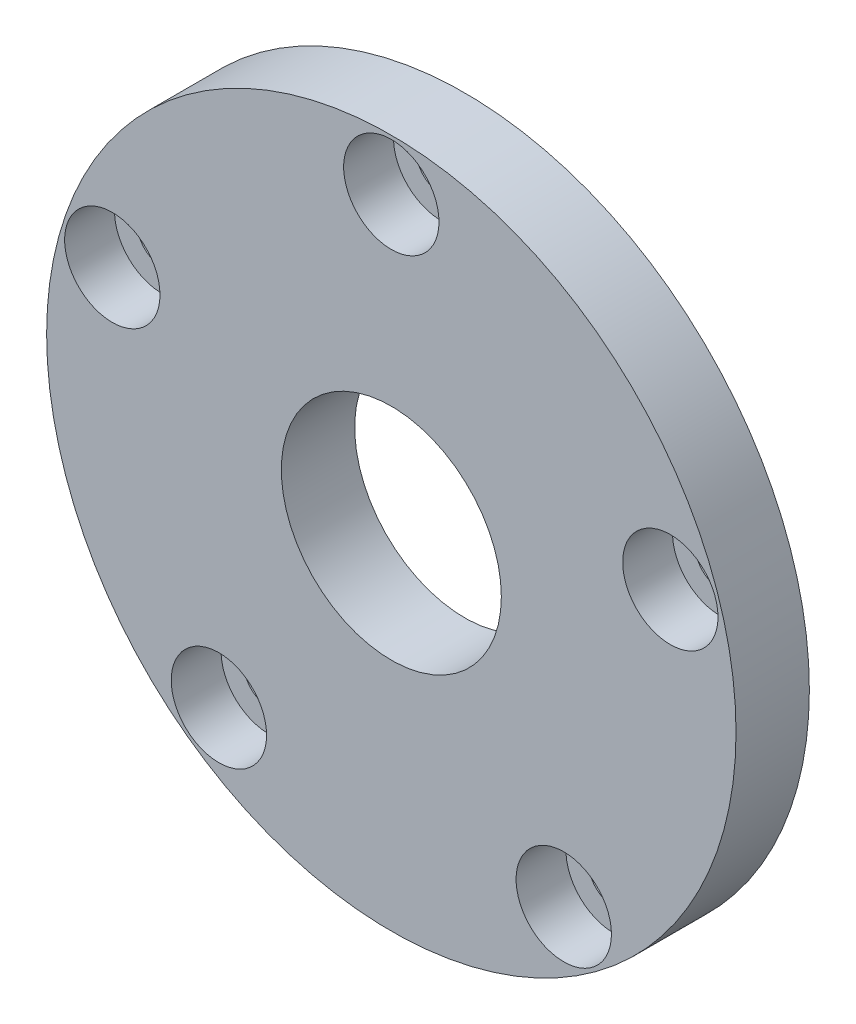
ISO-10303-21;
HEADER;
FILE_DESCRIPTION(('STEP AP214'),'2;1');
FILE_NAME('part.step','',(''),(''),'','','');
FILE_SCHEMA(('AUTOMOTIVE_DESIGN { 1 0 10303 214 1 1 1 1 }'));
ENDSEC;
DATA;
#1=APPLICATION_CONTEXT('core data for automotive mechanical design processes');
#2=APPLICATION_PROTOCOL_DEFINITION('international standard','automotive_design',2000,#1);
#3=PRODUCT_CONTEXT('',#1,'mechanical');
#4=PRODUCT('Part','Part','',(#3));
#5=PRODUCT_RELATED_PRODUCT_CATEGORY('part','',(#4));
#6=PRODUCT_DEFINITION_FORMATION('','',#4);
#7=PRODUCT_DEFINITION_CONTEXT('part definition',#1,'design');
#8=PRODUCT_DEFINITION('design','',#6,#7);
#9=PRODUCT_DEFINITION_SHAPE('','',#8);
#10=(LENGTH_UNIT() NAMED_UNIT(*) SI_UNIT(.MILLI.,.METRE.));
#11=(NAMED_UNIT(*) PLANE_ANGLE_UNIT() SI_UNIT($,.RADIAN.));
#12=(NAMED_UNIT(*) SI_UNIT($,.STERADIAN.) SOLID_ANGLE_UNIT());
#13=UNCERTAINTY_MEASURE_WITH_UNIT(LENGTH_MEASURE(1.E-05),#10,'distance_accuracy_value','');
#14=(GEOMETRIC_REPRESENTATION_CONTEXT(3) GLOBAL_UNCERTAINTY_ASSIGNED_CONTEXT((#13)) GLOBAL_UNIT_ASSIGNED_CONTEXT((#10,
#11,#12)) REPRESENTATION_CONTEXT('',''));
#15=CARTESIAN_POINT('',(0.,0.,0.));
#16=DIRECTION('',(0.,0.,1.));
#17=DIRECTION('',(1.,0.,0.));
#18=AXIS2_PLACEMENT_3D('',#15,#16,#17);
#19=CARTESIAN_POINT('',(0.,0.,5.));
#20=DIRECTION('',(0.,0.,-1.));
#21=DIRECTION('',(-1.,0.,0.));
#22=AXIS2_PLACEMENT_3D('',#19,#20,#21);
#23=CYLINDRICAL_SURFACE('',#22,23.5);
#24=CARTESIAN_POINT('',(0.,0.,5.));
#25=DIRECTION('',(0.,0.,1.));
#26=DIRECTION('',(1.,0.,0.));
#27=AXIS2_PLACEMENT_3D('',#24,#25,#26);
#28=CIRCLE('',#27,23.5);
#29=CARTESIAN_POINT('',(23.5,0.,5.));
#30=VERTEX_POINT('',#29);
#31=EDGE_CURVE('E10',#30,#30,#28,.T.);
#32=ORIENTED_EDGE('',*,*,#31,.F.);
#33=EDGE_LOOP('',(#32));
#34=FACE_BOUND('',#33,.T.);
#35=CARTESIAN_POINT('',(0.,0.,0.));
#36=DIRECTION('',(0.,0.,1.));
#37=DIRECTION('',(1.,0.,0.));
#38=AXIS2_PLACEMENT_3D('',#35,#36,#37);
#39=CIRCLE('',#38,23.5);
#40=CARTESIAN_POINT('',(23.5,0.,0.));
#41=VERTEX_POINT('',#40);
#42=EDGE_CURVE('E51',#41,#41,#39,.T.);
#43=ORIENTED_EDGE('',*,*,#42,.T.);
#44=EDGE_LOOP('',(#43));
#45=FACE_BOUND('',#44,.T.);
#46=ADVANCED_FACE('F43',(#34,#45),#23,.T.);
#47=CARTESIAN_POINT('',(0.,0.,5.));
#48=DIRECTION('',(0.,0.,1.));
#49=DIRECTION('',(1.,0.,0.));
#50=AXIS2_PLACEMENT_3D('',#47,#48,#49);
#51=PLANE('',#50);
#52=CARTESIAN_POINT('',(19.021130325903,6.18033988749916,5.));
#53=DIRECTION('',(0.,0.,1.));
#54=DIRECTION('',(1.,0.,0.));
#55=AXIS2_PLACEMENT_3D('',#52,#53,#54);
#56=CIRCLE('',#55,3.25);
#57=CARTESIAN_POINT('',(22.271130325903,6.18033988749916,5.));
#58=VERTEX_POINT('',#57);
#59=EDGE_CURVE('E219',#58,#58,#56,.T.);
#60=ORIENTED_EDGE('',*,*,#59,.F.);
#61=EDGE_LOOP('',(#60));
#62=FACE_BOUND('',#61,.T.);
#63=CARTESIAN_POINT('',(11.7557050458496,-16.1803398874988,5.));
#64=DIRECTION('',(0.,0.,1.));
#65=DIRECTION('',(1.,0.,0.));
#66=AXIS2_PLACEMENT_3D('',#63,#64,#65);
#67=CIRCLE('',#66,3.25);
#68=CARTESIAN_POINT('',(15.0057050458496,-16.1803398874988,5.));
#69=VERTEX_POINT('',#68);
#70=EDGE_CURVE('E98',#69,#69,#67,.T.);
#71=ORIENTED_EDGE('',*,*,#70,.F.);
#72=EDGE_LOOP('',(#71));
#73=FACE_BOUND('',#72,.T.);
#74=CARTESIAN_POINT('',(-11.7557050458494,-16.180339887499,5.));
#75=DIRECTION('',(0.,0.,1.));
#76=DIRECTION('',(1.,0.,0.));
#77=AXIS2_PLACEMENT_3D('',#74,#75,#76);
#78=CIRCLE('',#77,3.25);
#79=CARTESIAN_POINT('',(-8.50570504584937,-16.180339887499,5.));
#80=VERTEX_POINT('',#79);
#81=EDGE_CURVE('E82',#80,#80,#78,.T.);
#82=ORIENTED_EDGE('',*,*,#81,.F.);
#83=EDGE_LOOP('',(#82));
#84=FACE_BOUND('',#83,.T.);
#85=CARTESIAN_POINT('',(-19.0211303259031,6.1803398874989,5.));
#86=DIRECTION('',(0.,0.,1.));
#87=DIRECTION('',(1.,0.,0.));
#88=AXIS2_PLACEMENT_3D('',#85,#86,#87);
#89=CIRCLE('',#88,3.25);
#90=CARTESIAN_POINT('',(-15.7711303259031,6.1803398874989,5.));
#91=VERTEX_POINT('',#90);
#92=EDGE_CURVE('E77',#91,#91,#89,.T.);
#93=ORIENTED_EDGE('',*,*,#92,.F.);
#94=EDGE_LOOP('',(#93));
#95=FACE_BOUND('',#94,.T.);
#96=CARTESIAN_POINT('',(0.,20.,5.));
#97=DIRECTION('',(0.,0.,1.));
#98=DIRECTION('',(1.,0.,0.));
#99=AXIS2_PLACEMENT_3D('',#96,#97,#98);
#100=CIRCLE('',#99,3.25);
#101=CARTESIAN_POINT('',(3.25,20.,5.));
#102=VERTEX_POINT('',#101);
#103=EDGE_CURVE('E72',#102,#102,#100,.T.);
#104=ORIENTED_EDGE('',*,*,#103,.F.);
#105=EDGE_LOOP('',(#104));
#106=FACE_BOUND('',#105,.T.);
#107=CARTESIAN_POINT('',(0.,0.,5.));
#108=DIRECTION('',(0.,0.,1.));
#109=DIRECTION('',(1.,0.,0.));
#110=AXIS2_PLACEMENT_3D('',#107,#108,#109);
#111=CIRCLE('',#110,7.5);
#112=CARTESIAN_POINT('',(7.5,0.,5.));
#113=VERTEX_POINT('',#112);
#114=EDGE_CURVE('E57',#113,#113,#111,.T.);
#115=ORIENTED_EDGE('',*,*,#114,.F.);
#116=EDGE_LOOP('',(#115));
#117=FACE_BOUND('',#116,.T.);
#118=ORIENTED_EDGE('',*,*,#31,.T.);
#119=EDGE_LOOP('',(#118));
#120=FACE_BOUND('',#119,.T.);
#121=ADVANCED_FACE('F138',(#62,#73,#84,#95,#106,#117,#120),#51,.T.);
#122=CARTESIAN_POINT('',(0.,0.,0.));
#123=DIRECTION('',(0.,0.,1.));
#124=DIRECTION('',(1.,0.,0.));
#125=AXIS2_PLACEMENT_3D('',#122,#123,#124);
#126=PLANE('',#125);
#127=CARTESIAN_POINT('',(19.021130325903,6.18033988749916,0.));
#128=DIRECTION('',(0.,0.,1.));
#129=DIRECTION('',(1.,0.,0.));
#130=AXIS2_PLACEMENT_3D('',#127,#128,#129);
#131=CIRCLE('',#130,1.69999999999999);
#132=CARTESIAN_POINT('',(20.721130325903,6.18033988749916,0.));
#133=VERTEX_POINT('',#132);
#134=EDGE_CURVE('E46',#133,#133,#131,.T.);
#135=ORIENTED_EDGE('',*,*,#134,.T.);
#136=EDGE_LOOP('',(#135));
#137=FACE_BOUND('',#136,.T.);
#138=CARTESIAN_POINT('',(11.7557050458496,-16.1803398874988,0.));
#139=DIRECTION('',(0.,0.,1.));
#140=DIRECTION('',(1.,0.,0.));
#141=AXIS2_PLACEMENT_3D('',#138,#139,#140);
#142=CIRCLE('',#141,1.69999999999999);
#143=CARTESIAN_POINT('',(13.4557050458496,-16.1803398874988,0.));
#144=VERTEX_POINT('',#143);
#145=EDGE_CURVE('E79',#144,#144,#142,.T.);
#146=ORIENTED_EDGE('',*,*,#145,.T.);
#147=EDGE_LOOP('',(#146));
#148=FACE_BOUND('',#147,.T.);
#149=CARTESIAN_POINT('',(-11.7557050458494,-16.180339887499,0.));
#150=DIRECTION('',(0.,0.,1.));
#151=DIRECTION('',(1.,0.,0.));
#152=AXIS2_PLACEMENT_3D('',#149,#150,#151);
#153=CIRCLE('',#152,1.69999999999999);
#154=CARTESIAN_POINT('',(-10.0557050458494,-16.180339887499,0.));
#155=VERTEX_POINT('',#154);
#156=EDGE_CURVE('E74',#155,#155,#153,.T.);
#157=ORIENTED_EDGE('',*,*,#156,.T.);
#158=EDGE_LOOP('',(#157));
#159=FACE_BOUND('',#158,.T.);
#160=CARTESIAN_POINT('',(-19.0211303259031,6.1803398874989,0.));
#161=DIRECTION('',(0.,0.,1.));
#162=DIRECTION('',(1.,0.,0.));
#163=AXIS2_PLACEMENT_3D('',#160,#161,#162);
#164=CIRCLE('',#163,1.69999999999999);
#165=CARTESIAN_POINT('',(-17.3211303259031,6.1803398874989,0.));
#166=VERTEX_POINT('',#165);
#167=EDGE_CURVE('E68',#166,#166,#164,.T.);
#168=ORIENTED_EDGE('',*,*,#167,.T.);
#169=EDGE_LOOP('',(#168));
#170=FACE_BOUND('',#169,.T.);
#171=CARTESIAN_POINT('',(0.,20.,0.));
#172=DIRECTION('',(0.,0.,1.));
#173=DIRECTION('',(1.,0.,0.));
#174=AXIS2_PLACEMENT_3D('',#171,#172,#173);
#175=CIRCLE('',#174,1.69999999999999);
#176=CARTESIAN_POINT('',(1.69999999999999,20.,0.));
#177=VERTEX_POINT('',#176);
#178=EDGE_CURVE('E62',#177,#177,#175,.T.);
#179=ORIENTED_EDGE('',*,*,#178,.T.);
#180=EDGE_LOOP('',(#179));
#181=FACE_BOUND('',#180,.T.);
#182=CARTESIAN_POINT('',(0.,0.,0.));
#183=DIRECTION('',(0.,0.,1.));
#184=DIRECTION('',(1.,0.,0.));
#185=AXIS2_PLACEMENT_3D('',#182,#183,#184);
#186=CIRCLE('',#185,7.5);
#187=CARTESIAN_POINT('',(7.5,0.,0.));
#188=VERTEX_POINT('',#187);
#189=EDGE_CURVE('E66',#188,#188,#186,.T.);
#190=ORIENTED_EDGE('',*,*,#189,.T.);
#191=EDGE_LOOP('',(#190));
#192=FACE_BOUND('',#191,.T.);
#193=ORIENTED_EDGE('',*,*,#42,.F.);
#194=EDGE_LOOP('',(#193));
#195=FACE_BOUND('',#194,.T.);
#196=ADVANCED_FACE('F140',(#137,#148,#159,#170,#181,#192,#195),#126,.F.);
#197=CARTESIAN_POINT('',(0.,0.,0.));
#198=DIRECTION('',(0.,0.,1.));
#199=DIRECTION('',(1.,0.,0.));
#200=AXIS2_PLACEMENT_3D('',#197,#198,#199);
#201=CYLINDRICAL_SURFACE('',#200,7.5);
#202=ORIENTED_EDGE('',*,*,#114,.T.);
#203=EDGE_LOOP('',(#202));
#204=FACE_BOUND('',#203,.T.);
#205=ORIENTED_EDGE('',*,*,#189,.F.);
#206=EDGE_LOOP('',(#205));
#207=FACE_BOUND('',#206,.T.);
#208=ADVANCED_FACE('F135',(#204,#207),#201,.F.);
#209=CARTESIAN_POINT('',(0.,20.,5.));
#210=DIRECTION('',(0.,0.,1.));
#211=DIRECTION('',(1.,0.,0.));
#212=AXIS2_PLACEMENT_3D('',#209,#210,#211);
#213=CYLINDRICAL_SURFACE('',#212,1.69999999999999);
#214=CARTESIAN_POINT('',(0.,20.,1.6));
#215=DIRECTION('',(0.,0.,1.));
#216=DIRECTION('',(1.,0.,0.));
#217=AXIS2_PLACEMENT_3D('',#214,#215,#216);
#218=CIRCLE('',#217,1.7);
#219=CARTESIAN_POINT('',(1.7,20.,1.6));
#220=VERTEX_POINT('',#219);
#221=EDGE_CURVE('E67',#220,#220,#218,.T.);
#222=ORIENTED_EDGE('',*,*,#221,.T.);
#223=EDGE_LOOP('',(#222));
#224=FACE_BOUND('',#223,.T.);
#225=ORIENTED_EDGE('',*,*,#178,.F.);
#226=EDGE_LOOP('',(#225));
#227=FACE_BOUND('',#226,.T.);
#228=ADVANCED_FACE('F155',(#224,#227),#213,.F.);
#229=CARTESIAN_POINT('',(1.7,20.,1.6));
#230=DIRECTION('',(0.,0.,-1.));
#231=DIRECTION('',(-1.,0.,0.));
#232=AXIS2_PLACEMENT_3D('',#229,#230,#231);
#233=PLANE('',#232);
#234=ORIENTED_EDGE('',*,*,#221,.F.);
#235=EDGE_LOOP('',(#234));
#236=FACE_BOUND('',#235,.T.);
#237=CARTESIAN_POINT('',(0.,20.,1.6));
#238=DIRECTION('',(0.,0.,1.));
#239=DIRECTION('',(1.,0.,0.));
#240=AXIS2_PLACEMENT_3D('',#237,#238,#239);
#241=CIRCLE('',#240,3.25);
#242=CARTESIAN_POINT('',(3.25,20.,1.6));
#243=VERTEX_POINT('',#242);
#244=EDGE_CURVE('E121',#243,#243,#241,.T.);
#245=ORIENTED_EDGE('',*,*,#244,.T.);
#246=EDGE_LOOP('',(#245));
#247=FACE_BOUND('',#246,.T.);
#248=ADVANCED_FACE('F158',(#236,#247),#233,.F.);
#249=CARTESIAN_POINT('',(0.,20.,5.));
#250=DIRECTION('',(0.,0.,1.));
#251=DIRECTION('',(1.,0.,0.));
#252=AXIS2_PLACEMENT_3D('',#249,#250,#251);
#253=CYLINDRICAL_SURFACE('',#252,3.25);
#254=ORIENTED_EDGE('',*,*,#244,.F.);
#255=EDGE_LOOP('',(#254));
#256=FACE_BOUND('',#255,.T.);
#257=ORIENTED_EDGE('',*,*,#103,.T.);
#258=EDGE_LOOP('',(#257));
#259=FACE_BOUND('',#258,.T.);
#260=ADVANCED_FACE('F162',(#256,#259),#253,.F.);
#261=CARTESIAN_POINT('',(-19.0211303259031,6.1803398874989,5.));
#262=DIRECTION('',(0.,0.,1.));
#263=DIRECTION('',(1.,0.,0.));
#264=AXIS2_PLACEMENT_3D('',#261,#262,#263);
#265=CYLINDRICAL_SURFACE('',#264,1.69999999999999);
#266=CARTESIAN_POINT('',(-19.0211303259031,6.1803398874989,1.6));
#267=DIRECTION('',(0.,0.,1.));
#268=DIRECTION('',(1.,0.,0.));
#269=AXIS2_PLACEMENT_3D('',#266,#267,#268);
#270=CIRCLE('',#269,1.7);
#271=CARTESIAN_POINT('',(-17.3211303259031,6.1803398874989,1.6));
#272=VERTEX_POINT('',#271);
#273=EDGE_CURVE('E73',#272,#272,#270,.T.);
#274=ORIENTED_EDGE('',*,*,#273,.T.);
#275=EDGE_LOOP('',(#274));
#276=FACE_BOUND('',#275,.T.);
#277=ORIENTED_EDGE('',*,*,#167,.F.);
#278=EDGE_LOOP('',(#277));
#279=FACE_BOUND('',#278,.T.);
#280=ADVANCED_FACE('F165',(#276,#279),#265,.F.);
#281=CARTESIAN_POINT('',(-17.3211303259031,6.1803398874989,1.6));
#282=DIRECTION('',(0.,0.,-1.));
#283=DIRECTION('',(-1.,0.,0.));
#284=AXIS2_PLACEMENT_3D('',#281,#282,#283);
#285=PLANE('',#284);
#286=ORIENTED_EDGE('',*,*,#273,.F.);
#287=EDGE_LOOP('',(#286));
#288=FACE_BOUND('',#287,.T.);
#289=CARTESIAN_POINT('',(-19.0211303259031,6.1803398874989,1.6));
#290=DIRECTION('',(0.,0.,1.));
#291=DIRECTION('',(1.,0.,0.));
#292=AXIS2_PLACEMENT_3D('',#289,#290,#291);
#293=CIRCLE('',#292,3.25);
#294=CARTESIAN_POINT('',(-15.7711303259031,6.1803398874989,1.6));
#295=VERTEX_POINT('',#294);
#296=EDGE_CURVE('E111',#295,#295,#293,.T.);
#297=ORIENTED_EDGE('',*,*,#296,.T.);
#298=EDGE_LOOP('',(#297));
#299=FACE_BOUND('',#298,.T.);
#300=ADVANCED_FACE('F169',(#288,#299),#285,.F.);
#301=CARTESIAN_POINT('',(-19.0211303259031,6.1803398874989,5.));
#302=DIRECTION('',(0.,0.,1.));
#303=DIRECTION('',(1.,0.,0.));
#304=AXIS2_PLACEMENT_3D('',#301,#302,#303);
#305=CYLINDRICAL_SURFACE('',#304,3.25);
#306=ORIENTED_EDGE('',*,*,#296,.F.);
#307=EDGE_LOOP('',(#306));
#308=FACE_BOUND('',#307,.T.);
#309=ORIENTED_EDGE('',*,*,#92,.T.);
#310=EDGE_LOOP('',(#309));
#311=FACE_BOUND('',#310,.T.);
#312=ADVANCED_FACE('F173',(#308,#311),#305,.F.);
#313=CARTESIAN_POINT('',(-11.7557050458494,-16.180339887499,5.));
#314=DIRECTION('',(0.,0.,1.));
#315=DIRECTION('',(1.,0.,0.));
#316=AXIS2_PLACEMENT_3D('',#313,#314,#315);
#317=CYLINDRICAL_SURFACE('',#316,1.69999999999999);
#318=CARTESIAN_POINT('',(-11.7557050458494,-16.180339887499,1.6));
#319=DIRECTION('',(0.,0.,1.));
#320=DIRECTION('',(1.,0.,0.));
#321=AXIS2_PLACEMENT_3D('',#318,#319,#320);
#322=CIRCLE('',#321,1.7);
#323=CARTESIAN_POINT('',(-10.0557050458494,-16.180339887499,1.6));
#324=VERTEX_POINT('',#323);
#325=EDGE_CURVE('E78',#324,#324,#322,.T.);
#326=ORIENTED_EDGE('',*,*,#325,.T.);
#327=EDGE_LOOP('',(#326));
#328=FACE_BOUND('',#327,.T.);
#329=ORIENTED_EDGE('',*,*,#156,.F.);
#330=EDGE_LOOP('',(#329));
#331=FACE_BOUND('',#330,.T.);
#332=ADVANCED_FACE('F177',(#328,#331),#317,.F.);
#333=CARTESIAN_POINT('',(-10.0557050458494,-16.180339887499,1.6));
#334=DIRECTION('',(0.,0.,-1.));
#335=DIRECTION('',(-1.,0.,0.));
#336=AXIS2_PLACEMENT_3D('',#333,#334,#335);
#337=PLANE('',#336);
#338=ORIENTED_EDGE('',*,*,#325,.F.);
#339=EDGE_LOOP('',(#338));
#340=FACE_BOUND('',#339,.T.);
#341=CARTESIAN_POINT('',(-11.7557050458494,-16.180339887499,1.6));
#342=DIRECTION('',(0.,0.,1.));
#343=DIRECTION('',(1.,0.,0.));
#344=AXIS2_PLACEMENT_3D('',#341,#342,#343);
#345=CIRCLE('',#344,3.25);
#346=CARTESIAN_POINT('',(-8.50570504584937,-16.180339887499,1.6));
#347=VERTEX_POINT('',#346);
#348=EDGE_CURVE('E89',#347,#347,#345,.T.);
#349=ORIENTED_EDGE('',*,*,#348,.T.);
#350=EDGE_LOOP('',(#349));
#351=FACE_BOUND('',#350,.T.);
#352=ADVANCED_FACE('F181',(#340,#351),#337,.F.);
#353=CARTESIAN_POINT('',(-11.7557050458494,-16.180339887499,5.));
#354=DIRECTION('',(0.,0.,1.));
#355=DIRECTION('',(1.,0.,0.));
#356=AXIS2_PLACEMENT_3D('',#353,#354,#355);
#357=CYLINDRICAL_SURFACE('',#356,3.25);
#358=ORIENTED_EDGE('',*,*,#348,.F.);
#359=EDGE_LOOP('',(#358));
#360=FACE_BOUND('',#359,.T.);
#361=ORIENTED_EDGE('',*,*,#81,.T.);
#362=EDGE_LOOP('',(#361));
#363=FACE_BOUND('',#362,.T.);
#364=ADVANCED_FACE('F185',(#360,#363),#357,.F.);
#365=CARTESIAN_POINT('',(11.7557050458496,-16.1803398874988,5.));
#366=DIRECTION('',(0.,0.,1.));
#367=DIRECTION('',(1.,0.,0.));
#368=AXIS2_PLACEMENT_3D('',#365,#366,#367);
#369=CYLINDRICAL_SURFACE('',#368,1.69999999999999);
#370=CARTESIAN_POINT('',(11.7557050458496,-16.1803398874988,1.6));
#371=DIRECTION('',(0.,0.,1.));
#372=DIRECTION('',(1.,0.,0.));
#373=AXIS2_PLACEMENT_3D('',#370,#371,#372);
#374=CIRCLE('',#373,1.7);
#375=CARTESIAN_POINT('',(13.4557050458496,-16.1803398874988,1.6));
#376=VERTEX_POINT('',#375);
#377=EDGE_CURVE('E83',#376,#376,#374,.T.);
#378=ORIENTED_EDGE('',*,*,#377,.T.);
#379=EDGE_LOOP('',(#378));
#380=FACE_BOUND('',#379,.T.);
#381=ORIENTED_EDGE('',*,*,#145,.F.);
#382=EDGE_LOOP('',(#381));
#383=FACE_BOUND('',#382,.T.);
#384=ADVANCED_FACE('F189',(#380,#383),#369,.F.);
#385=CARTESIAN_POINT('',(13.4557050458496,-16.1803398874988,1.6));
#386=DIRECTION('',(0.,0.,-1.));
#387=DIRECTION('',(-1.,0.,0.));
#388=AXIS2_PLACEMENT_3D('',#385,#386,#387);
#389=PLANE('',#388);
#390=ORIENTED_EDGE('',*,*,#377,.F.);
#391=EDGE_LOOP('',(#390));
#392=FACE_BOUND('',#391,.T.);
#393=CARTESIAN_POINT('',(11.7557050458496,-16.1803398874988,1.6));
#394=DIRECTION('',(0.,0.,1.));
#395=DIRECTION('',(1.,0.,0.));
#396=AXIS2_PLACEMENT_3D('',#393,#394,#395);
#397=CIRCLE('',#396,3.25);
#398=CARTESIAN_POINT('',(15.0057050458496,-16.1803398874988,1.6));
#399=VERTEX_POINT('',#398);
#400=EDGE_CURVE('E92',#399,#399,#397,.T.);
#401=ORIENTED_EDGE('',*,*,#400,.T.);
#402=EDGE_LOOP('',(#401));
#403=FACE_BOUND('',#402,.T.);
#404=ADVANCED_FACE('F193',(#392,#403),#389,.F.);
#405=CARTESIAN_POINT('',(11.7557050458496,-16.1803398874988,5.));
#406=DIRECTION('',(0.,0.,1.));
#407=DIRECTION('',(1.,0.,0.));
#408=AXIS2_PLACEMENT_3D('',#405,#406,#407);
#409=CYLINDRICAL_SURFACE('',#408,3.25);
#410=ORIENTED_EDGE('',*,*,#400,.F.);
#411=EDGE_LOOP('',(#410));
#412=FACE_BOUND('',#411,.T.);
#413=ORIENTED_EDGE('',*,*,#70,.T.);
#414=EDGE_LOOP('',(#413));
#415=FACE_BOUND('',#414,.T.);
#416=ADVANCED_FACE('F196',(#412,#415),#409,.F.);
#417=CARTESIAN_POINT('',(19.021130325903,6.18033988749916,5.));
#418=DIRECTION('',(0.,0.,1.));
#419=DIRECTION('',(1.,0.,0.));
#420=AXIS2_PLACEMENT_3D('',#417,#418,#419);
#421=CYLINDRICAL_SURFACE('',#420,1.69999999999999);
#422=CARTESIAN_POINT('',(19.021130325903,6.18033988749916,1.6));
#423=DIRECTION('',(0.,0.,1.));
#424=DIRECTION('',(1.,0.,0.));
#425=AXIS2_PLACEMENT_3D('',#422,#423,#424);
#426=CIRCLE('',#425,1.7);
#427=CARTESIAN_POINT('',(20.721130325903,6.18033988749916,1.6));
#428=VERTEX_POINT('',#427);
#429=EDGE_CURVE('E223',#428,#428,#426,.T.);
#430=ORIENTED_EDGE('',*,*,#429,.T.);
#431=EDGE_LOOP('',(#430));
#432=FACE_BOUND('',#431,.T.);
#433=ORIENTED_EDGE('',*,*,#134,.F.);
#434=EDGE_LOOP('',(#433));
#435=FACE_BOUND('',#434,.T.);
#436=ADVANCED_FACE('F200',(#432,#435),#421,.F.);
#437=CARTESIAN_POINT('',(20.721130325903,6.18033988749916,1.6));
#438=DIRECTION('',(0.,0.,-1.));
#439=DIRECTION('',(-1.,0.,0.));
#440=AXIS2_PLACEMENT_3D('',#437,#438,#439);
#441=PLANE('',#440);
#442=ORIENTED_EDGE('',*,*,#429,.F.);
#443=EDGE_LOOP('',(#442));
#444=FACE_BOUND('',#443,.T.);
#445=CARTESIAN_POINT('',(19.021130325903,6.18033988749916,1.6));
#446=DIRECTION('',(0.,0.,1.));
#447=DIRECTION('',(1.,0.,0.));
#448=AXIS2_PLACEMENT_3D('',#445,#446,#447);
#449=CIRCLE('',#448,3.25);
#450=CARTESIAN_POINT('',(22.271130325903,6.18033988749916,1.6));
#451=VERTEX_POINT('',#450);
#452=EDGE_CURVE('E217',#451,#451,#449,.T.);
#453=ORIENTED_EDGE('',*,*,#452,.T.);
#454=EDGE_LOOP('',(#453));
#455=FACE_BOUND('',#454,.T.);
#456=ADVANCED_FACE('F204',(#444,#455),#441,.F.);
#457=CARTESIAN_POINT('',(19.021130325903,6.18033988749916,5.));
#458=DIRECTION('',(0.,0.,1.));
#459=DIRECTION('',(1.,0.,0.));
#460=AXIS2_PLACEMENT_3D('',#457,#458,#459);
#461=CYLINDRICAL_SURFACE('',#460,3.25);
#462=ORIENTED_EDGE('',*,*,#452,.F.);
#463=EDGE_LOOP('',(#462));
#464=FACE_BOUND('',#463,.T.);
#465=ORIENTED_EDGE('',*,*,#59,.T.);
#466=EDGE_LOOP('',(#465));
#467=FACE_BOUND('',#466,.T.);
#468=ADVANCED_FACE('F208',(#464,#467),#461,.F.);
#469=CLOSED_SHELL('',(#46,#121,#196,#208,#228,#248,#260,#280,#300,#312,#332,#352,#364,#384,#404,
#416,#436,#456,#468));
#470=MANIFOLD_SOLID_BREP('B2',#469);
#471=ADVANCED_BREP_SHAPE_REPRESENTATION('',(#18,#470),#14);
#472=SHAPE_DEFINITION_REPRESENTATION(#9,#471);
ENDSEC;
END-ISO-10303-21;
